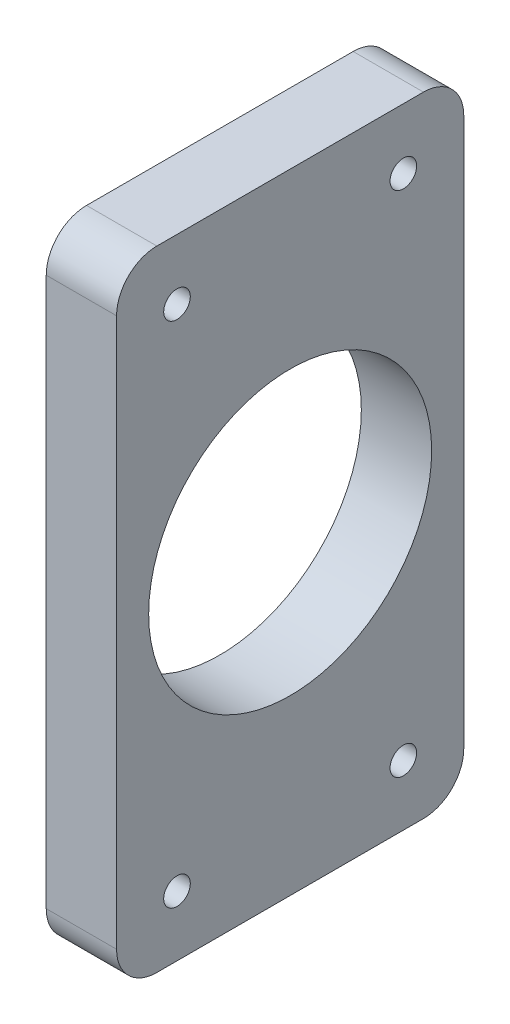
ISO-10303-21;
HEADER;
FILE_DESCRIPTION(('STEP AP214'),'2;1');
FILE_NAME('part.step','',(''),(''),'','','');
FILE_SCHEMA(('AUTOMOTIVE_DESIGN { 1 0 10303 214 1 1 1 1 }'));
ENDSEC;
DATA;
#1=APPLICATION_CONTEXT('core data for automotive mechanical design processes');
#2=APPLICATION_PROTOCOL_DEFINITION('international standard','automotive_design',2000,#1);
#3=PRODUCT_CONTEXT('',#1,'mechanical');
#4=PRODUCT('Part','Part','',(#3));
#5=PRODUCT_RELATED_PRODUCT_CATEGORY('part','',(#4));
#6=PRODUCT_DEFINITION_FORMATION('','',#4);
#7=PRODUCT_DEFINITION_CONTEXT('part definition',#1,'design');
#8=PRODUCT_DEFINITION('design','',#6,#7);
#9=PRODUCT_DEFINITION_SHAPE('','',#8);
#10=(LENGTH_UNIT() NAMED_UNIT(*) SI_UNIT(.MILLI.,.METRE.));
#11=(NAMED_UNIT(*) PLANE_ANGLE_UNIT() SI_UNIT($,.RADIAN.));
#12=(NAMED_UNIT(*) SI_UNIT($,.STERADIAN.) SOLID_ANGLE_UNIT());
#13=UNCERTAINTY_MEASURE_WITH_UNIT(LENGTH_MEASURE(1.E-05),#10,'distance_accuracy_value','');
#14=(GEOMETRIC_REPRESENTATION_CONTEXT(3) GLOBAL_UNCERTAINTY_ASSIGNED_CONTEXT((#13)) GLOBAL_UNIT_ASSIGNED_CONTEXT((#10,
#11,#12)) REPRESENTATION_CONTEXT('',''));
#15=CARTESIAN_POINT('',(0.,0.,0.));
#16=DIRECTION('',(0.,0.,1.));
#17=DIRECTION('',(1.,0.,0.));
#18=AXIS2_PLACEMENT_3D('',#15,#16,#17);
#19=CARTESIAN_POINT('',(-13.096875,-39.05,21.55));
#20=DIRECTION('',(0.,0.,-1.));
#21=DIRECTION('',(-1.,0.,0.));
#22=AXIS2_PLACEMENT_3D('',#19,#20,#21);
#23=PLANE('',#22);
#24=DIRECTION('',(0.,1.,0.));
#25=VECTOR('',#24,1.);
#26=CARTESIAN_POINT('',(-13.096875,-39.05,21.55));
#27=LINE('',#26,#25);
#28=CARTESIAN_POINT('',(-13.096875,-34.05,21.55));
#29=VERTEX_POINT('',#28);
#30=CARTESIAN_POINT('',(-13.096875,34.05,21.55));
#31=VERTEX_POINT('',#30);
#32=EDGE_CURVE('E559',#29,#31,#27,.T.);
#33=ORIENTED_EDGE('',*,*,#32,.F.);
#34=DIRECTION('',(1.,0.,0.));
#35=VECTOR('',#34,1.);
#36=CARTESIAN_POINT('',(-13.096875,-34.05,21.55));
#37=LINE('',#36,#35);
#38=CARTESIAN_POINT('',(-4.365625,-34.05,21.55));
#39=VERTEX_POINT('',#38);
#40=EDGE_CURVE('E544',#29,#39,#37,.T.);
#41=ORIENTED_EDGE('',*,*,#40,.T.);
#42=DIRECTION('',(0.,1.,0.));
#43=VECTOR('',#42,1.);
#44=CARTESIAN_POINT('',(-4.365625,-39.05,21.55));
#45=LINE('',#44,#43);
#46=CARTESIAN_POINT('',(-4.365625,34.05,21.55));
#47=VERTEX_POINT('',#46);
#48=EDGE_CURVE('E558',#39,#47,#45,.T.);
#49=ORIENTED_EDGE('',*,*,#48,.T.);
#50=DIRECTION('',(1.,0.,0.));
#51=VECTOR('',#50,1.);
#52=CARTESIAN_POINT('',(-13.096875,34.05,21.55));
#53=LINE('',#52,#51);
#54=EDGE_CURVE('E565',#47,#31,#53,.F.);
#55=ORIENTED_EDGE('',*,*,#54,.T.);
#56=EDGE_LOOP('',(#33,#41,#49,#55));
#57=FACE_BOUND('',#56,.T.);
#58=ADVANCED_FACE('F475',(#57),#23,.F.);
#59=CARTESIAN_POINT('',(-13.096875,39.05,21.55));
#60=DIRECTION('',(0.,-1.,0.));
#61=DIRECTION('',(0.,0.,-1.));
#62=AXIS2_PLACEMENT_3D('',#59,#60,#61);
#63=PLANE('',#62);
#64=DIRECTION('',(0.,0.,-1.));
#65=VECTOR('',#64,1.);
#66=CARTESIAN_POINT('',(-4.365625,39.05,21.55));
#67=LINE('',#66,#65);
#68=CARTESIAN_POINT('',(-4.365625,39.05,16.55));
#69=VERTEX_POINT('',#68);
#70=CARTESIAN_POINT('',(-4.365625,39.05,-16.55));
#71=VERTEX_POINT('',#70);
#72=EDGE_CURVE('E570',#69,#71,#67,.T.);
#73=ORIENTED_EDGE('',*,*,#72,.T.);
#74=DIRECTION('',(1.,0.,0.));
#75=VECTOR('',#74,1.);
#76=CARTESIAN_POINT('',(-13.096875,39.05,-16.55));
#77=LINE('',#76,#75);
#78=CARTESIAN_POINT('',(-13.096875,39.05,-16.55));
#79=VERTEX_POINT('',#78);
#80=EDGE_CURVE('E14',#71,#79,#77,.F.);
#81=ORIENTED_EDGE('',*,*,#80,.T.);
#82=DIRECTION('',(0.,0.,-1.));
#83=VECTOR('',#82,1.);
#84=CARTESIAN_POINT('',(-13.096875,39.05,21.55));
#85=LINE('',#84,#83);
#86=CARTESIAN_POINT('',(-13.096875,39.05,16.55));
#87=VERTEX_POINT('',#86);
#88=EDGE_CURVE('E635',#87,#79,#85,.T.);
#89=ORIENTED_EDGE('',*,*,#88,.F.);
#90=DIRECTION('',(1.,0.,0.));
#91=VECTOR('',#90,1.);
#92=CARTESIAN_POINT('',(-13.096875,39.05,16.55));
#93=LINE('',#92,#91);
#94=EDGE_CURVE('E483',#87,#69,#93,.T.);
#95=ORIENTED_EDGE('',*,*,#94,.T.);
#96=EDGE_LOOP('',(#73,#81,#89,#95));
#97=FACE_BOUND('',#96,.T.);
#98=ADVANCED_FACE('F629',(#97),#63,.F.);
#99=CARTESIAN_POINT('',(-13.096875,-39.05,-21.55));
#100=DIRECTION('',(0.,0.,1.));
#101=DIRECTION('',(1.,0.,0.));
#102=AXIS2_PLACEMENT_3D('',#99,#100,#101);
#103=PLANE('',#102);
#104=DIRECTION('',(0.,-1.,0.));
#105=VECTOR('',#104,1.);
#106=CARTESIAN_POINT('',(-4.365625,-39.05,-21.55));
#107=LINE('',#106,#105);
#108=CARTESIAN_POINT('',(-4.365625,34.05,-21.55));
#109=VERTEX_POINT('',#108);
#110=CARTESIAN_POINT('',(-4.365625,-34.05,-21.55));
#111=VERTEX_POINT('',#110);
#112=EDGE_CURVE('E573',#109,#111,#107,.T.);
#113=ORIENTED_EDGE('',*,*,#112,.T.);
#114=DIRECTION('',(1.,0.,0.));
#115=VECTOR('',#114,1.);
#116=CARTESIAN_POINT('',(-13.096875,-34.05,-21.55));
#117=LINE('',#116,#115);
#118=CARTESIAN_POINT('',(-13.096875,-34.05,-21.55));
#119=VERTEX_POINT('',#118);
#120=EDGE_CURVE('E486',#111,#119,#117,.F.);
#121=ORIENTED_EDGE('',*,*,#120,.T.);
#122=DIRECTION('',(0.,-1.,0.));
#123=VECTOR('',#122,1.);
#124=CARTESIAN_POINT('',(-13.096875,-39.05,-21.55));
#125=LINE('',#124,#123);
#126=CARTESIAN_POINT('',(-13.096875,34.05,-21.55));
#127=VERTEX_POINT('',#126);
#128=EDGE_CURVE('E639',#127,#119,#125,.T.);
#129=ORIENTED_EDGE('',*,*,#128,.F.);
#130=DIRECTION('',(1.,0.,0.));
#131=VECTOR('',#130,1.);
#132=CARTESIAN_POINT('',(-13.096875,34.05,-21.55));
#133=LINE('',#132,#131);
#134=EDGE_CURVE('E620',#127,#109,#133,.T.);
#135=ORIENTED_EDGE('',*,*,#134,.T.);
#136=EDGE_LOOP('',(#113,#121,#129,#135));
#137=FACE_BOUND('',#136,.T.);
#138=ADVANCED_FACE('F638',(#137),#103,.F.);
#139=CARTESIAN_POINT('',(-13.096875,-39.05,21.55));
#140=DIRECTION('',(0.,1.,0.));
#141=DIRECTION('',(0.,0.,1.));
#142=AXIS2_PLACEMENT_3D('',#139,#140,#141);
#143=PLANE('',#142);
#144=DIRECTION('',(0.,0.,1.));
#145=VECTOR('',#144,1.);
#146=CARTESIAN_POINT('',(-4.365625,-39.05,21.55));
#147=LINE('',#146,#145);
#148=CARTESIAN_POINT('',(-4.365625,-39.05,-16.55));
#149=VERTEX_POINT('',#148);
#150=CARTESIAN_POINT('',(-4.365625,-39.05,16.55));
#151=VERTEX_POINT('',#150);
#152=EDGE_CURVE('E584',#149,#151,#147,.T.);
#153=ORIENTED_EDGE('',*,*,#152,.T.);
#154=DIRECTION('',(1.,0.,0.));
#155=VECTOR('',#154,1.);
#156=CARTESIAN_POINT('',(-13.096875,-39.05,16.55));
#157=LINE('',#156,#155);
#158=CARTESIAN_POINT('',(-13.096875,-39.05,16.55));
#159=VERTEX_POINT('',#158);
#160=EDGE_CURVE('E541',#151,#159,#157,.F.);
#161=ORIENTED_EDGE('',*,*,#160,.T.);
#162=DIRECTION('',(0.,0.,1.));
#163=VECTOR('',#162,1.);
#164=CARTESIAN_POINT('',(-13.096875,-39.05,21.55));
#165=LINE('',#164,#163);
#166=CARTESIAN_POINT('',(-13.096875,-39.05,-16.55));
#167=VERTEX_POINT('',#166);
#168=EDGE_CURVE('E578',#167,#159,#165,.T.);
#169=ORIENTED_EDGE('',*,*,#168,.F.);
#170=DIRECTION('',(1.,0.,0.));
#171=VECTOR('',#170,1.);
#172=CARTESIAN_POINT('',(-13.096875,-39.05,-16.55));
#173=LINE('',#172,#171);
#174=EDGE_CURVE('E549',#167,#149,#173,.T.);
#175=ORIENTED_EDGE('',*,*,#174,.T.);
#176=EDGE_LOOP('',(#153,#161,#169,#175));
#177=FACE_BOUND('',#176,.T.);
#178=ADVANCED_FACE('F731',(#177),#143,.F.);
#179=CARTESIAN_POINT('',(-13.096875,0.,0.));
#180=DIRECTION('',(-1.,0.,0.));
#181=DIRECTION('',(0.,0.,1.));
#182=AXIS2_PLACEMENT_3D('',#179,#180,#181);
#183=PLANE('',#182);
#184=CARTESIAN_POINT('',(-13.096875,0.,0.));
#185=DIRECTION('',(1.,0.,0.));
#186=DIRECTION('',(0.,0.,-1.));
#187=AXIS2_PLACEMENT_3D('',#184,#185,#186);
#188=CIRCLE('',#187,17.5641);
#189=CARTESIAN_POINT('',(-13.096875,0.,-17.5641));
#190=VERTEX_POINT('',#189);
#191=EDGE_CURVE('E591',#190,#190,#188,.T.);
#192=ORIENTED_EDGE('',*,*,#191,.T.);
#193=EDGE_LOOP('',(#192));
#194=FACE_BOUND('',#193,.T.);
#195=CARTESIAN_POINT('',(-13.096875,31.55,14.05));
#196=DIRECTION('',(-1.,0.,0.));
#197=DIRECTION('',(0.,0.,1.));
#198=AXIS2_PLACEMENT_3D('',#195,#196,#197);
#199=CIRCLE('',#198,1.675);
#200=CARTESIAN_POINT('',(-13.096875,31.55,15.725));
#201=VERTEX_POINT('',#200);
#202=EDGE_CURVE('E595',#201,#201,#199,.T.);
#203=ORIENTED_EDGE('',*,*,#202,.F.);
#204=EDGE_LOOP('',(#203));
#205=FACE_BOUND('',#204,.T.);
#206=CARTESIAN_POINT('',(-13.096875,31.55,-14.05));
#207=DIRECTION('',(-1.,0.,0.));
#208=DIRECTION('',(0.,0.,1.));
#209=AXIS2_PLACEMENT_3D('',#206,#207,#208);
#210=CIRCLE('',#209,1.675);
#211=CARTESIAN_POINT('',(-13.096875,31.55,-12.375));
#212=VERTEX_POINT('',#211);
#213=EDGE_CURVE('E676',#212,#212,#210,.T.);
#214=ORIENTED_EDGE('',*,*,#213,.F.);
#215=EDGE_LOOP('',(#214));
#216=FACE_BOUND('',#215,.T.);
#217=CARTESIAN_POINT('',(-13.096875,-31.55,-14.05));
#218=DIRECTION('',(-1.,0.,0.));
#219=DIRECTION('',(0.,0.,1.));
#220=AXIS2_PLACEMENT_3D('',#217,#218,#219);
#221=CIRCLE('',#220,1.675);
#222=CARTESIAN_POINT('',(-13.096875,-31.55,-12.375));
#223=VERTEX_POINT('',#222);
#224=EDGE_CURVE('E668',#223,#223,#221,.T.);
#225=ORIENTED_EDGE('',*,*,#224,.F.);
#226=EDGE_LOOP('',(#225));
#227=FACE_BOUND('',#226,.T.);
#228=CARTESIAN_POINT('',(-13.096875,-31.55,14.05));
#229=DIRECTION('',(-1.,0.,0.));
#230=DIRECTION('',(0.,0.,1.));
#231=AXIS2_PLACEMENT_3D('',#228,#229,#230);
#232=CIRCLE('',#231,1.675);
#233=CARTESIAN_POINT('',(-13.096875,-31.55,15.725));
#234=VERTEX_POINT('',#233);
#235=EDGE_CURVE('E651',#234,#234,#232,.T.);
#236=ORIENTED_EDGE('',*,*,#235,.F.);
#237=EDGE_LOOP('',(#236));
#238=FACE_BOUND('',#237,.T.);
#239=ORIENTED_EDGE('',*,*,#168,.T.);
#240=CARTESIAN_POINT('',(-13.096875,-34.05,16.55));
#241=DIRECTION('',(-1.,0.,0.));
#242=DIRECTION('',(0.,0.,1.));
#243=AXIS2_PLACEMENT_3D('',#240,#241,#242);
#244=CIRCLE('',#243,5.);
#245=EDGE_CURVE('E618',#159,#29,#244,.T.);
#246=ORIENTED_EDGE('',*,*,#245,.T.);
#247=ORIENTED_EDGE('',*,*,#32,.T.);
#248=CARTESIAN_POINT('',(-13.096875,34.05,16.55));
#249=DIRECTION('',(-1.,0.,0.));
#250=DIRECTION('',(0.,0.,1.));
#251=AXIS2_PLACEMENT_3D('',#248,#249,#250);
#252=CIRCLE('',#251,5.);
#253=EDGE_CURVE('E609',#31,#87,#252,.T.);
#254=ORIENTED_EDGE('',*,*,#253,.T.);
#255=ORIENTED_EDGE('',*,*,#88,.T.);
#256=CARTESIAN_POINT('',(-13.096875,34.05,-16.55));
#257=DIRECTION('',(-1.,0.,0.));
#258=DIRECTION('',(0.,0.,1.));
#259=AXIS2_PLACEMENT_3D('',#256,#257,#258);
#260=CIRCLE('',#259,5.);
#261=EDGE_CURVE('E492',#79,#127,#260,.T.);
#262=ORIENTED_EDGE('',*,*,#261,.T.);
#263=ORIENTED_EDGE('',*,*,#128,.T.);
#264=CARTESIAN_POINT('',(-13.096875,-34.05,-16.55));
#265=DIRECTION('',(-1.,0.,0.));
#266=DIRECTION('',(0.,0.,1.));
#267=AXIS2_PLACEMENT_3D('',#264,#265,#266);
#268=CIRCLE('',#267,5.);
#269=EDGE_CURVE('E611',#119,#167,#268,.T.);
#270=ORIENTED_EDGE('',*,*,#269,.T.);
#271=EDGE_LOOP('',(#239,#246,#247,#254,#255,#262,#263,#270));
#272=FACE_BOUND('',#271,.T.);
#273=ADVANCED_FACE('F698',(#194,#205,#216,#227,#238,#272),#183,.T.);
#274=CARTESIAN_POINT('',(-4.365625,0.,0.));
#275=DIRECTION('',(-1.,0.,0.));
#276=DIRECTION('',(0.,0.,1.));
#277=AXIS2_PLACEMENT_3D('',#274,#275,#276);
#278=PLANE('',#277);
#279=CARTESIAN_POINT('',(-4.365625,0.,0.));
#280=DIRECTION('',(-1.,0.,0.));
#281=DIRECTION('',(0.,0.,1.));
#282=AXIS2_PLACEMENT_3D('',#279,#280,#281);
#283=CIRCLE('',#282,17.5641);
#284=CARTESIAN_POINT('',(-4.365625,0.,-17.5641));
#285=VERTEX_POINT('',#284);
#286=EDGE_CURVE('E589',#285,#285,#283,.T.);
#287=ORIENTED_EDGE('',*,*,#286,.T.);
#288=EDGE_LOOP('',(#287));
#289=FACE_BOUND('',#288,.T.);
#290=CARTESIAN_POINT('',(-4.365625,31.55,14.05));
#291=DIRECTION('',(-1.,0.,0.));
#292=DIRECTION('',(0.,0.,1.));
#293=AXIS2_PLACEMENT_3D('',#290,#291,#292);
#294=CIRCLE('',#293,1.65);
#295=CARTESIAN_POINT('',(-4.365625,31.55,15.7));
#296=VERTEX_POINT('',#295);
#297=EDGE_CURVE('E682',#296,#296,#294,.T.);
#298=ORIENTED_EDGE('',*,*,#297,.T.);
#299=EDGE_LOOP('',(#298));
#300=FACE_BOUND('',#299,.T.);
#301=CARTESIAN_POINT('',(-4.365625,31.55,-14.05));
#302=DIRECTION('',(-1.,0.,0.));
#303=DIRECTION('',(0.,0.,1.));
#304=AXIS2_PLACEMENT_3D('',#301,#302,#303);
#305=CIRCLE('',#304,1.65);
#306=CARTESIAN_POINT('',(-4.365625,31.55,-12.4));
#307=VERTEX_POINT('',#306);
#308=EDGE_CURVE('E669',#307,#307,#305,.T.);
#309=ORIENTED_EDGE('',*,*,#308,.T.);
#310=EDGE_LOOP('',(#309));
#311=FACE_BOUND('',#310,.T.);
#312=CARTESIAN_POINT('',(-4.365625,-31.55,-14.05));
#313=DIRECTION('',(-1.,0.,0.));
#314=DIRECTION('',(0.,0.,1.));
#315=AXIS2_PLACEMENT_3D('',#312,#313,#314);
#316=CIRCLE('',#315,1.65);
#317=CARTESIAN_POINT('',(-4.365625,-31.55,-12.4));
#318=VERTEX_POINT('',#317);
#319=EDGE_CURVE('E656',#318,#318,#316,.T.);
#320=ORIENTED_EDGE('',*,*,#319,.T.);
#321=EDGE_LOOP('',(#320));
#322=FACE_BOUND('',#321,.T.);
#323=CARTESIAN_POINT('',(-4.365625,-31.55,14.05));
#324=DIRECTION('',(-1.,0.,0.));
#325=DIRECTION('',(0.,0.,1.));
#326=AXIS2_PLACEMENT_3D('',#323,#324,#325);
#327=CIRCLE('',#326,1.65);
#328=CARTESIAN_POINT('',(-4.365625,-31.55,15.7));
#329=VERTEX_POINT('',#328);
#330=EDGE_CURVE('E568',#329,#329,#327,.T.);
#331=ORIENTED_EDGE('',*,*,#330,.T.);
#332=EDGE_LOOP('',(#331));
#333=FACE_BOUND('',#332,.T.);
#334=ORIENTED_EDGE('',*,*,#48,.F.);
#335=CARTESIAN_POINT('',(-4.365625,-34.05,16.55));
#336=DIRECTION('',(-1.,0.,0.));
#337=DIRECTION('',(0.,0.,1.));
#338=AXIS2_PLACEMENT_3D('',#335,#336,#337);
#339=CIRCLE('',#338,5.);
#340=EDGE_CURVE('E537',#39,#151,#339,.F.);
#341=ORIENTED_EDGE('',*,*,#340,.T.);
#342=ORIENTED_EDGE('',*,*,#152,.F.);
#343=CARTESIAN_POINT('',(-4.365625,-34.05,-16.55));
#344=DIRECTION('',(-1.,0.,0.));
#345=DIRECTION('',(0.,0.,1.));
#346=AXIS2_PLACEMENT_3D('',#343,#344,#345);
#347=CIRCLE('',#346,5.);
#348=EDGE_CURVE('E553',#149,#111,#347,.F.);
#349=ORIENTED_EDGE('',*,*,#348,.T.);
#350=ORIENTED_EDGE('',*,*,#112,.F.);
#351=CARTESIAN_POINT('',(-4.365625,34.05,-16.55));
#352=DIRECTION('',(-1.,0.,0.));
#353=DIRECTION('',(0.,0.,1.));
#354=AXIS2_PLACEMENT_3D('',#351,#352,#353);
#355=CIRCLE('',#354,5.);
#356=EDGE_CURVE('E596',#109,#71,#355,.F.);
#357=ORIENTED_EDGE('',*,*,#356,.T.);
#358=ORIENTED_EDGE('',*,*,#72,.F.);
#359=CARTESIAN_POINT('',(-4.365625,34.05,16.55));
#360=DIRECTION('',(-1.,0.,0.));
#361=DIRECTION('',(0.,0.,1.));
#362=AXIS2_PLACEMENT_3D('',#359,#360,#361);
#363=CIRCLE('',#362,5.);
#364=EDGE_CURVE('E561',#69,#47,#363,.F.);
#365=ORIENTED_EDGE('',*,*,#364,.T.);
#366=EDGE_LOOP('',(#334,#341,#342,#349,#350,#357,#358,#365));
#367=FACE_BOUND('',#366,.T.);
#368=ADVANCED_FACE('F562',(#289,#300,#311,#322,#333,#367),#278,.F.);
#369=CARTESIAN_POINT('',(-13.096875,-31.55,14.05));
#370=DIRECTION('',(-1.,0.,0.));
#371=DIRECTION('',(0.,0.,1.));
#372=AXIS2_PLACEMENT_3D('',#369,#370,#371);
#373=CYLINDRICAL_SURFACE('',#372,1.65);
#374=ORIENTED_EDGE('',*,*,#330,.F.);
#375=EDGE_LOOP('',(#374));
#376=FACE_BOUND('',#375,.T.);
#377=CARTESIAN_POINT('',(-13.071875,-31.55,14.05));
#378=DIRECTION('',(-1.,0.,0.));
#379=DIRECTION('',(0.,0.,1.));
#380=AXIS2_PLACEMENT_3D('',#377,#378,#379);
#381=CIRCLE('',#380,1.65);
#382=CARTESIAN_POINT('',(-13.071875,-31.55,15.7));
#383=VERTEX_POINT('',#382);
#384=EDGE_CURVE('E580',#383,#383,#381,.T.);
#385=ORIENTED_EDGE('',*,*,#384,.T.);
#386=EDGE_LOOP('',(#385));
#387=FACE_BOUND('',#386,.T.);
#388=ADVANCED_FACE('F708',(#376,#387),#373,.F.);
#389=CARTESIAN_POINT('',(-13.096875,-31.55,14.05));
#390=DIRECTION('',(-1.,0.,0.));
#391=DIRECTION('',(0.,0.,1.));
#392=AXIS2_PLACEMENT_3D('',#389,#390,#391);
#393=CONICAL_SURFACE('',#392,1.675,0.785398163397414);
#394=ORIENTED_EDGE('',*,*,#384,.F.);
#395=EDGE_LOOP('',(#394));
#396=FACE_BOUND('',#395,.T.);
#397=ORIENTED_EDGE('',*,*,#235,.T.);
#398=EDGE_LOOP('',(#397));
#399=FACE_BOUND('',#398,.T.);
#400=ADVANCED_FACE('F725',(#396,#399),#393,.F.);
#401=CARTESIAN_POINT('',(-13.096875,-31.55,-14.05));
#402=DIRECTION('',(-1.,0.,0.));
#403=DIRECTION('',(0.,0.,1.));
#404=AXIS2_PLACEMENT_3D('',#401,#402,#403);
#405=CYLINDRICAL_SURFACE('',#404,1.65);
#406=ORIENTED_EDGE('',*,*,#319,.F.);
#407=EDGE_LOOP('',(#406));
#408=FACE_BOUND('',#407,.T.);
#409=CARTESIAN_POINT('',(-13.071875,-31.55,-14.05));
#410=DIRECTION('',(-1.,0.,0.));
#411=DIRECTION('',(0.,0.,1.));
#412=AXIS2_PLACEMENT_3D('',#409,#410,#411);
#413=CIRCLE('',#412,1.65);
#414=CARTESIAN_POINT('',(-13.071875,-31.55,-12.4));
#415=VERTEX_POINT('',#414);
#416=EDGE_CURVE('E665',#415,#415,#413,.T.);
#417=ORIENTED_EDGE('',*,*,#416,.T.);
#418=EDGE_LOOP('',(#417));
#419=FACE_BOUND('',#418,.T.);
#420=ADVANCED_FACE('F726',(#408,#419),#405,.F.);
#421=CARTESIAN_POINT('',(-13.096875,-31.55,-14.05));
#422=DIRECTION('',(-1.,0.,0.));
#423=DIRECTION('',(0.,0.,1.));
#424=AXIS2_PLACEMENT_3D('',#421,#422,#423);
#425=CONICAL_SURFACE('',#424,1.675,0.785398163397414);
#426=ORIENTED_EDGE('',*,*,#416,.F.);
#427=EDGE_LOOP('',(#426));
#428=FACE_BOUND('',#427,.T.);
#429=ORIENTED_EDGE('',*,*,#224,.T.);
#430=EDGE_LOOP('',(#429));
#431=FACE_BOUND('',#430,.T.);
#432=ADVANCED_FACE('F759',(#428,#431),#425,.F.);
#433=CARTESIAN_POINT('',(-13.096875,31.55,-14.05));
#434=DIRECTION('',(-1.,0.,0.));
#435=DIRECTION('',(0.,0.,1.));
#436=AXIS2_PLACEMENT_3D('',#433,#434,#435);
#437=CYLINDRICAL_SURFACE('',#436,1.65);
#438=ORIENTED_EDGE('',*,*,#308,.F.);
#439=EDGE_LOOP('',(#438));
#440=FACE_BOUND('',#439,.T.);
#441=CARTESIAN_POINT('',(-13.071875,31.55,-14.05));
#442=DIRECTION('',(-1.,0.,0.));
#443=DIRECTION('',(0.,0.,1.));
#444=AXIS2_PLACEMENT_3D('',#441,#442,#443);
#445=CIRCLE('',#444,1.65);
#446=CARTESIAN_POINT('',(-13.071875,31.55,-12.4));
#447=VERTEX_POINT('',#446);
#448=EDGE_CURVE('E671',#447,#447,#445,.T.);
#449=ORIENTED_EDGE('',*,*,#448,.T.);
#450=EDGE_LOOP('',(#449));
#451=FACE_BOUND('',#450,.T.);
#452=ADVANCED_FACE('F762',(#440,#451),#437,.F.);
#453=CARTESIAN_POINT('',(-13.096875,31.55,-14.05));
#454=DIRECTION('',(-1.,0.,0.));
#455=DIRECTION('',(0.,0.,1.));
#456=AXIS2_PLACEMENT_3D('',#453,#454,#455);
#457=CONICAL_SURFACE('',#456,1.675,0.785398163397483);
#458=ORIENTED_EDGE('',*,*,#448,.F.);
#459=EDGE_LOOP('',(#458));
#460=FACE_BOUND('',#459,.T.);
#461=ORIENTED_EDGE('',*,*,#213,.T.);
#462=EDGE_LOOP('',(#461));
#463=FACE_BOUND('',#462,.T.);
#464=ADVANCED_FACE('F767',(#460,#463),#457,.F.);
#465=CARTESIAN_POINT('',(-13.096875,31.55,14.05));
#466=DIRECTION('',(-1.,0.,0.));
#467=DIRECTION('',(0.,0.,1.));
#468=AXIS2_PLACEMENT_3D('',#465,#466,#467);
#469=CYLINDRICAL_SURFACE('',#468,1.65);
#470=ORIENTED_EDGE('',*,*,#297,.F.);
#471=EDGE_LOOP('',(#470));
#472=FACE_BOUND('',#471,.T.);
#473=CARTESIAN_POINT('',(-13.071875,31.55,14.05));
#474=DIRECTION('',(-1.,0.,0.));
#475=DIRECTION('',(0.,0.,1.));
#476=AXIS2_PLACEMENT_3D('',#473,#474,#475);
#477=CIRCLE('',#476,1.65);
#478=CARTESIAN_POINT('',(-13.071875,31.55,15.7));
#479=VERTEX_POINT('',#478);
#480=EDGE_CURVE('E688',#479,#479,#477,.T.);
#481=ORIENTED_EDGE('',*,*,#480,.T.);
#482=EDGE_LOOP('',(#481));
#483=FACE_BOUND('',#482,.T.);
#484=ADVANCED_FACE('F775',(#472,#483),#469,.F.);
#485=CARTESIAN_POINT('',(-13.096875,31.55,14.05));
#486=DIRECTION('',(-1.,0.,0.));
#487=DIRECTION('',(0.,0.,1.));
#488=AXIS2_PLACEMENT_3D('',#485,#486,#487);
#489=CONICAL_SURFACE('',#488,1.675,0.785398163397483);
#490=ORIENTED_EDGE('',*,*,#480,.F.);
#491=EDGE_LOOP('',(#490));
#492=FACE_BOUND('',#491,.T.);
#493=ORIENTED_EDGE('',*,*,#202,.T.);
#494=EDGE_LOOP('',(#493));
#495=FACE_BOUND('',#494,.T.);
#496=ADVANCED_FACE('F703',(#492,#495),#489,.F.);
#497=CARTESIAN_POINT('',(-13.096875,0.,0.));
#498=DIRECTION('',(1.,0.,0.));
#499=DIRECTION('',(0.,0.,-1.));
#500=AXIS2_PLACEMENT_3D('',#497,#498,#499);
#501=CYLINDRICAL_SURFACE('',#500,17.5641);
#502=CARTESIAN_POINT('',(-13.096875,0.,-17.5641));
#503=CARTESIAN_POINT('',(-13.0059244791667,0.,-17.5641));
#504=CARTESIAN_POINT('',(-12.9149739583333,0.,-17.5641));
#505=CARTESIAN_POINT('',(-12.7330729166667,0.,-17.5641));
#506=CARTESIAN_POINT('',(-12.6421223958333,0.,-17.5641));
#507=CARTESIAN_POINT('',(-12.4602213541667,0.,-17.5641));
#508=CARTESIAN_POINT('',(-12.3692708333333,0.,-17.5641));
#509=CARTESIAN_POINT('',(-12.1873697916667,0.,-17.5641));
#510=CARTESIAN_POINT('',(-12.0964192708333,0.,-17.5641));
#511=CARTESIAN_POINT('',(-11.9145182291667,0.,-17.5641));
#512=CARTESIAN_POINT('',(-11.8235677083333,0.,-17.5641));
#513=CARTESIAN_POINT('',(-11.6416666666667,0.,-17.5641));
#514=CARTESIAN_POINT('',(-11.5507161458333,0.,-17.5641));
#515=CARTESIAN_POINT('',(-11.3688151041667,0.,-17.5641));
#516=CARTESIAN_POINT('',(-11.2778645833333,0.,-17.5641));
#517=CARTESIAN_POINT('',(-11.0959635416667,0.,-17.5641));
#518=CARTESIAN_POINT('',(-11.0050130208333,0.,-17.5641));
#519=CARTESIAN_POINT('',(-10.8231119791667,0.,-17.5641));
#520=CARTESIAN_POINT('',(-10.7321614583333,0.,-17.5641));
#521=CARTESIAN_POINT('',(-10.5502604166667,0.,-17.5641));
#522=CARTESIAN_POINT('',(-10.4593098958333,0.,-17.5641));
#523=CARTESIAN_POINT('',(-10.2774088541667,0.,-17.5641));
#524=CARTESIAN_POINT('',(-10.1864583333333,0.,-17.5641));
#525=CARTESIAN_POINT('',(-10.0045572916667,0.,-17.5641));
#526=CARTESIAN_POINT('',(-9.91360677083333,0.,-17.5641));
#527=CARTESIAN_POINT('',(-9.73170572916667,0.,-17.5641));
#528=CARTESIAN_POINT('',(-9.64075520833333,0.,-17.5641));
#529=CARTESIAN_POINT('',(-9.45885416666667,0.,-17.5641));
#530=CARTESIAN_POINT('',(-9.36790364583333,0.,-17.5641));
#531=CARTESIAN_POINT('',(-9.18600260416667,0.,-17.5641));
#532=CARTESIAN_POINT('',(-9.09505208333333,0.,-17.5641));
#533=CARTESIAN_POINT('',(-8.91315104166667,0.,-17.5641));
#534=CARTESIAN_POINT('',(-8.82220052083333,0.,-17.5641));
#535=CARTESIAN_POINT('',(-8.64029947916667,0.,-17.5641));
#536=CARTESIAN_POINT('',(-8.54934895833333,0.,-17.5641));
#537=CARTESIAN_POINT('',(-8.36744791666667,0.,-17.5641));
#538=CARTESIAN_POINT('',(-8.27649739583333,0.,-17.5641));
#539=CARTESIAN_POINT('',(-8.09459635416667,0.,-17.5641));
#540=CARTESIAN_POINT('',(-8.00364583333333,0.,-17.5641));
#541=CARTESIAN_POINT('',(-7.82174479166666,0.,-17.5641));
#542=CARTESIAN_POINT('',(-7.73079427083333,0.,-17.5641));
#543=CARTESIAN_POINT('',(-7.54889322916667,0.,-17.5641));
#544=CARTESIAN_POINT('',(-7.45794270833333,0.,-17.5641));
#545=CARTESIAN_POINT('',(-7.27604166666667,0.,-17.5641));
#546=CARTESIAN_POINT('',(-7.18509114583333,0.,-17.5641));
#547=CARTESIAN_POINT('',(-7.00319010416667,0.,-17.5641));
#548=CARTESIAN_POINT('',(-6.91223958333333,0.,-17.5641));
#549=CARTESIAN_POINT('',(-6.73033854166667,0.,-17.5641));
#550=CARTESIAN_POINT('',(-6.63938802083333,0.,-17.5641));
#551=CARTESIAN_POINT('',(-6.45748697916667,0.,-17.5641));
#552=CARTESIAN_POINT('',(-6.36653645833333,0.,-17.5641));
#553=CARTESIAN_POINT('',(-6.18463541666666,0.,-17.5641));
#554=CARTESIAN_POINT('',(-6.09368489583333,0.,-17.5641));
#555=CARTESIAN_POINT('',(-5.91178385416667,0.,-17.5641));
#556=CARTESIAN_POINT('',(-5.82083333333333,0.,-17.5641));
#557=CARTESIAN_POINT('',(-5.63893229166666,0.,-17.5641));
#558=CARTESIAN_POINT('',(-5.54798177083333,0.,-17.5641));
#559=CARTESIAN_POINT('',(-5.36608072916666,0.,-17.5641));
#560=CARTESIAN_POINT('',(-5.27513020833333,0.,-17.5641));
#561=CARTESIAN_POINT('',(-5.09322916666667,0.,-17.5641));
#562=CARTESIAN_POINT('',(-5.00227864583333,0.,-17.5641));
#563=CARTESIAN_POINT('',(-4.82037760416666,0.,-17.5641));
#564=CARTESIAN_POINT('',(-4.72942708333333,0.,-17.5641));
#565=CARTESIAN_POINT('',(-4.54752604166667,0.,-17.5641));
#566=CARTESIAN_POINT('',(-4.45657552083333,0.,-17.5641));
#567=CARTESIAN_POINT('',(-4.365625,0.,-17.5641));
#568=B_SPLINE_CURVE_WITH_KNOTS('',3,(#502,#503,#504,#505,#506,#507,#508,#509,#510,#511,#512,
#513,#514,#515,#516,#517,#518,#519,#520,#521,#522,#523,#524,#525,#526,#527,#528,#529,#530,#531,
#532,#533,#534,#535,#536,#537,#538,#539,#540,#541,#542,#543,#544,#545,#546,#547,#548,#549,#550,
#551,#552,#553,#554,#555,#556,#557,#558,#559,#560,#561,#562,#563,#564,#565,#566,#567),
.UNSPECIFIED.,.F.,.F.,(4,2,2,2,2,2,2,2,2,2,2,2,2,2,2,2,2,2,2,2,2,2,2,2,2,2,2,2,2,2,2,2,4),(0.,
0.272851562500001,0.545703125000002,0.818554687500002,1.09140625,1.3642578125,1.637109375,
1.9099609375,2.1828125,2.4556640625,2.728515625,3.0013671875,3.27421875,3.5470703125,
3.819921875,4.0927734375,4.365625,4.6384765625,4.911328125,5.18417968750001,5.45703125000001,
5.7298828125,6.00273437500001,6.27558593750001,6.54843750000001,6.82128906250001,
7.09414062500001,7.36699218750001,7.63984375000001,7.91269531250001,8.18554687500001,
8.4583984375,8.73125000000001),.UNSPECIFIED.);
#569=EDGE_CURVE('BSEAM701',#190,#285,#568,.T.);
#570=ORIENTED_EDGE('',*,*,#191,.F.);
#571=ORIENTED_EDGE('',*,*,#286,.F.);
#572=ORIENTED_EDGE('',*,*,#569,.T.);
#573=ORIENTED_EDGE('',*,*,#569,.F.);
#574=EDGE_LOOP('',(#570,#572,#571,#573));
#575=FACE_BOUND('',#574,.T.);
#576=ADVANCED_FACE('F701',(#575),#501,.F.);
#577=CARTESIAN_POINT('',(-13.096875,-34.05,16.55));
#578=DIRECTION('',(1.,0.,0.));
#579=DIRECTION('',(0.,0.,-1.));
#580=AXIS2_PLACEMENT_3D('',#577,#578,#579);
#581=CYLINDRICAL_SURFACE('',#580,5.);
#582=ORIENTED_EDGE('',*,*,#245,.F.);
#583=ORIENTED_EDGE('',*,*,#160,.F.);
#584=ORIENTED_EDGE('',*,*,#340,.F.);
#585=ORIENTED_EDGE('',*,*,#40,.F.);
#586=EDGE_LOOP('',(#582,#583,#584,#585));
#587=FACE_BOUND('',#586,.T.);
#588=ADVANCED_FACE('F545',(#587),#581,.T.);
#589=CARTESIAN_POINT('',(-13.096875,-34.05,-16.55));
#590=DIRECTION('',(1.,0.,0.));
#591=DIRECTION('',(0.,0.,-1.));
#592=AXIS2_PLACEMENT_3D('',#589,#590,#591);
#593=CYLINDRICAL_SURFACE('',#592,5.);
#594=ORIENTED_EDGE('',*,*,#269,.F.);
#595=ORIENTED_EDGE('',*,*,#120,.F.);
#596=ORIENTED_EDGE('',*,*,#348,.F.);
#597=ORIENTED_EDGE('',*,*,#174,.F.);
#598=EDGE_LOOP('',(#594,#595,#596,#597));
#599=FACE_BOUND('',#598,.T.);
#600=ADVANCED_FACE('F736',(#599),#593,.T.);
#601=CARTESIAN_POINT('',(-13.096875,34.05,-16.55));
#602=DIRECTION('',(1.,0.,0.));
#603=DIRECTION('',(0.,0.,-1.));
#604=AXIS2_PLACEMENT_3D('',#601,#602,#603);
#605=CYLINDRICAL_SURFACE('',#604,5.);
#606=ORIENTED_EDGE('',*,*,#261,.F.);
#607=ORIENTED_EDGE('',*,*,#80,.F.);
#608=ORIENTED_EDGE('',*,*,#356,.F.);
#609=ORIENTED_EDGE('',*,*,#134,.F.);
#610=EDGE_LOOP('',(#606,#607,#608,#609));
#611=FACE_BOUND('',#610,.T.);
#612=ADVANCED_FACE('F637',(#611),#605,.T.);
#613=CARTESIAN_POINT('',(-13.096875,34.05,16.55));
#614=DIRECTION('',(1.,0.,0.));
#615=DIRECTION('',(0.,0.,-1.));
#616=AXIS2_PLACEMENT_3D('',#613,#614,#615);
#617=CYLINDRICAL_SURFACE('',#616,5.);
#618=ORIENTED_EDGE('',*,*,#253,.F.);
#619=ORIENTED_EDGE('',*,*,#54,.F.);
#620=ORIENTED_EDGE('',*,*,#364,.F.);
#621=ORIENTED_EDGE('',*,*,#94,.F.);
#622=EDGE_LOOP('',(#618,#619,#620,#621));
#623=FACE_BOUND('',#622,.T.);
#624=ADVANCED_FACE('F472',(#623),#617,.T.);
#625=CLOSED_SHELL('',(#58,#98,#138,#178,#273,#368,#388,#400,#420,#432,#452,#464,#484,#496,#576,
#588,#600,#612,#624));
#626=MANIFOLD_SOLID_BREP('B2',#625);
#627=ADVANCED_BREP_SHAPE_REPRESENTATION('',(#18,#626),#14);
#628=SHAPE_DEFINITION_REPRESENTATION(#9,#627);
ENDSEC;
END-ISO-10303-21;
